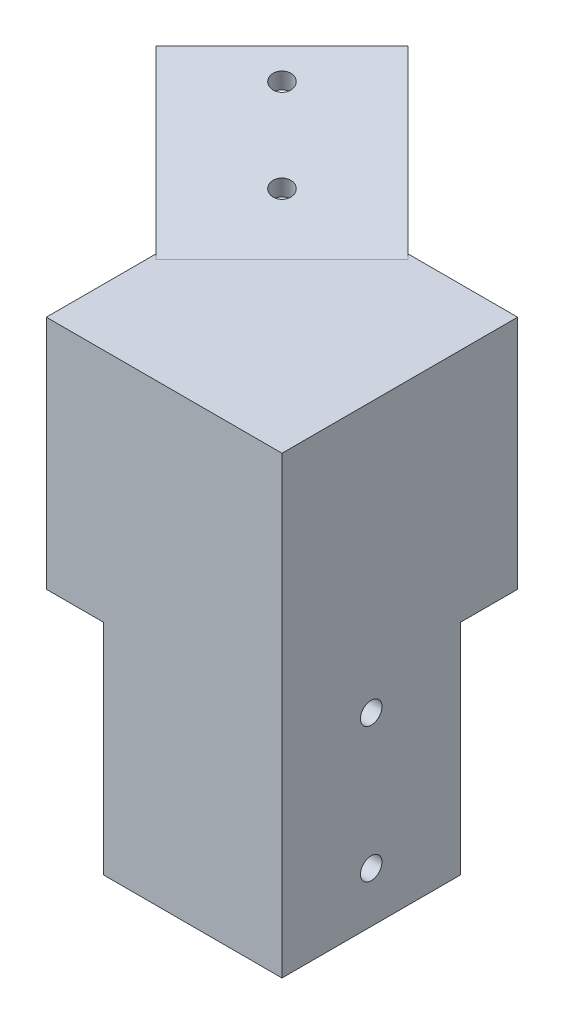
ISO-10303-21;
HEADER;
FILE_DESCRIPTION(('STEP AP214'),'2;1');
FILE_NAME('part.step','',(''),(''),'','','');
FILE_SCHEMA(('AUTOMOTIVE_DESIGN { 1 0 10303 214 1 1 1 1 }'));
ENDSEC;
DATA;
#1=APPLICATION_CONTEXT('core data for automotive mechanical design processes');
#2=APPLICATION_PROTOCOL_DEFINITION('international standard','automotive_design',2000,#1);
#3=PRODUCT_CONTEXT('',#1,'mechanical');
#4=PRODUCT('Part','Part','',(#3));
#5=PRODUCT_RELATED_PRODUCT_CATEGORY('part','',(#4));
#6=PRODUCT_DEFINITION_FORMATION('','',#4);
#7=PRODUCT_DEFINITION_CONTEXT('part definition',#1,'design');
#8=PRODUCT_DEFINITION('design','',#6,#7);
#9=PRODUCT_DEFINITION_SHAPE('','',#8);
#10=(LENGTH_UNIT() NAMED_UNIT(*) SI_UNIT(.MILLI.,.METRE.));
#11=(NAMED_UNIT(*) PLANE_ANGLE_UNIT() SI_UNIT($,.RADIAN.));
#12=(NAMED_UNIT(*) SI_UNIT($,.STERADIAN.) SOLID_ANGLE_UNIT());
#13=UNCERTAINTY_MEASURE_WITH_UNIT(LENGTH_MEASURE(1.E-05),#10,'distance_accuracy_value','');
#14=(GEOMETRIC_REPRESENTATION_CONTEXT(3) GLOBAL_UNCERTAINTY_ASSIGNED_CONTEXT((#13)) GLOBAL_UNIT_ASSIGNED_CONTEXT((#10,
#11,#12)) REPRESENTATION_CONTEXT('',''));
#15=CARTESIAN_POINT('',(0.,0.,0.));
#16=DIRECTION('',(0.,0.,1.));
#17=DIRECTION('',(1.,0.,0.));
#18=AXIS2_PLACEMENT_3D('',#15,#16,#17);
#19=CARTESIAN_POINT('',(-10.25,-50.,-10.25));
#20=DIRECTION('',(0.,0.,-1.));
#21=DIRECTION('',(-1.,0.,0.));
#22=AXIS2_PLACEMENT_3D('',#19,#20,#21);
#23=PLANE('',#22);
#24=DIRECTION('',(0.,1.,0.));
#25=VECTOR('',#24,1.);
#26=CARTESIAN_POINT('',(4.24568901432425,-50.,-10.25));
#27=LINE('',#26,#25);
#28=CARTESIAN_POINT('',(4.24568901432421,-9.53015542412603,-10.25));
#29=VERTEX_POINT('',#28);
#30=CARTESIAN_POINT('',(4.24568901432424,0.,-10.25));
#31=VERTEX_POINT('',#30);
#32=EDGE_CURVE('E241',#29,#31,#27,.T.);
#33=ORIENTED_EDGE('',*,*,#32,.F.);
#34=DIRECTION('',(-0.986393923832144,0.164398987305357,0.));
#35=VECTOR('',#34,1.);
#36=CARTESIAN_POINT('',(-3.2955471224441,-8.27328273466465,-10.25));
#37=LINE('',#36,#35);
#38=CARTESIAN_POINT('',(-10.25,-7.11420725507199,-10.25));
#39=VERTEX_POINT('',#38);
#40=EDGE_CURVE('E246',#29,#39,#37,.T.);
#41=ORIENTED_EDGE('',*,*,#40,.T.);
#42=DIRECTION('',(0.,1.,0.));
#43=VECTOR('',#42,1.);
#44=CARTESIAN_POINT('',(-10.25,-50.,-10.25));
#45=LINE('',#44,#43);
#46=CARTESIAN_POINT('',(-10.25,-50.,-10.25));
#47=VERTEX_POINT('',#46);
#48=EDGE_CURVE('E371',#47,#39,#45,.T.);
#49=ORIENTED_EDGE('',*,*,#48,.F.);
#50=DIRECTION('',(-1.,0.,0.));
#51=VECTOR('',#50,1.);
#52=CARTESIAN_POINT('',(-10.25,-50.,-10.25));
#53=LINE('',#52,#51);
#54=CARTESIAN_POINT('',(10.25,-50.,-10.25));
#55=VERTEX_POINT('',#54);
#56=EDGE_CURVE('E355',#55,#47,#53,.T.);
#57=ORIENTED_EDGE('',*,*,#56,.F.);
#58=DIRECTION('',(0.,1.,0.));
#59=VECTOR('',#58,1.);
#60=CARTESIAN_POINT('',(10.25,-50.,-10.25));
#61=LINE('',#60,#59);
#62=CARTESIAN_POINT('',(10.25,0.,-10.25));
#63=VERTEX_POINT('',#62);
#64=EDGE_CURVE('E364',#55,#63,#61,.T.);
#65=ORIENTED_EDGE('',*,*,#64,.T.);
#66=DIRECTION('',(1.,0.,0.));
#67=VECTOR('',#66,1.);
#68=CARTESIAN_POINT('',(0.,0.,-10.25));
#69=LINE('',#68,#67);
#70=EDGE_CURVE('E252',#31,#63,#69,.T.);
#71=ORIENTED_EDGE('',*,*,#70,.F.);
#72=EDGE_LOOP('',(#33,#41,#49,#57,#65,#71));
#73=FACE_BOUND('',#72,.T.);
#74=ADVANCED_FACE('F47',(#73),#23,.F.);
#75=CARTESIAN_POINT('',(0.,0.,0.));
#76=DIRECTION('',(0.,1.,0.));
#77=DIRECTION('',(0.,0.,1.));
#78=AXIS2_PLACEMENT_3D('',#75,#76,#77);
#79=PLANE('',#78);
#80=DIRECTION('',(0.707106781186547,0.,0.707106781186548));
#81=VECTOR('',#80,1.);
#82=CARTESIAN_POINT('',(7.24784450716212,0.,-7.24784450716212));
#83=LINE('',#82,#81);
#84=CARTESIAN_POINT('',(7.24784450716211,0.,-7.24784450716212));
#85=VERTEX_POINT('',#84);
#86=EDGE_CURVE('E11',#31,#85,#83,.T.);
#87=ORIENTED_EDGE('',*,*,#86,.F.);
#88=ORIENTED_EDGE('',*,*,#70,.T.);
#89=DIRECTION('',(0.,0.,1.));
#90=VECTOR('',#89,1.);
#91=CARTESIAN_POINT('',(10.25,0.,0.));
#92=LINE('',#91,#90);
#93=CARTESIAN_POINT('',(10.25,0.,10.25));
#94=VERTEX_POINT('',#93);
#95=EDGE_CURVE('E249',#63,#94,#92,.T.);
#96=ORIENTED_EDGE('',*,*,#95,.T.);
#97=DIRECTION('',(1.,0.,0.));
#98=VECTOR('',#97,1.);
#99=CARTESIAN_POINT('',(0.,0.,10.25));
#100=LINE('',#99,#98);
#101=CARTESIAN_POINT('',(-10.25,0.,10.25));
#102=VERTEX_POINT('',#101);
#103=EDGE_CURVE('E256',#102,#94,#100,.T.);
#104=ORIENTED_EDGE('',*,*,#103,.F.);
#105=DIRECTION('',(0.,0.,1.));
#106=VECTOR('',#105,1.);
#107=CARTESIAN_POINT('',(-10.25,0.,0.));
#108=LINE('',#107,#106);
#109=CARTESIAN_POINT('',(-10.25,0.,4.24568901432423));
#110=VERTEX_POINT('',#109);
#111=EDGE_CURVE('E254',#110,#102,#108,.T.);
#112=ORIENTED_EDGE('',*,*,#111,.F.);
#113=DIRECTION('',(0.707106781186547,0.,0.707106781186548));
#114=VECTOR('',#113,1.);
#115=CARTESIAN_POINT('',(-7.24784450716211,0.,7.24784450716211));
#116=LINE('',#115,#114);
#117=CARTESIAN_POINT('',(-7.24784450716212,0.,7.24784450716211));
#118=VERTEX_POINT('',#117);
#119=EDGE_CURVE('E56',#110,#118,#116,.T.);
#120=ORIENTED_EDGE('',*,*,#119,.T.);
#121=DIRECTION('',(0.707106781186548,0.,-0.707106781186547));
#122=VECTOR('',#121,1.);
#123=CARTESIAN_POINT('',(0.,0.,0.));
#124=LINE('',#123,#122);
#125=EDGE_CURVE('E400',#118,#85,#124,.T.);
#126=ORIENTED_EDGE('',*,*,#125,.T.);
#127=EDGE_LOOP('',(#87,#88,#96,#104,#112,#120,#126));
#128=FACE_BOUND('',#127,.T.);
#129=ADVANCED_FACE('F473',(#128),#79,.F.);
#130=CARTESIAN_POINT('',(-13.25,-50.,-13.25));
#131=DIRECTION('',(0.,0.,-1.));
#132=DIRECTION('',(-1.,0.,0.));
#133=AXIS2_PLACEMENT_3D('',#130,#131,#132);
#134=PLANE('',#133);
#135=DIRECTION('',(-0.986393923832144,0.164398987305357,0.));
#136=VECTOR('',#135,1.);
#137=CARTESIAN_POINT('',(-6.63320231187402,-10.2992138712442,-13.25));
#138=LINE('',#137,#136);
#139=CARTESIAN_POINT('',(-11.5116702985565,-9.48613587346375,-13.25));
#140=VERTEX_POINT('',#139);
#141=CARTESIAN_POINT('',(-13.25,-9.1964142565565,-13.25));
#142=VERTEX_POINT('',#141);
#143=EDGE_CURVE('E335',#140,#142,#138,.T.);
#144=ORIENTED_EDGE('',*,*,#143,.F.);
#145=DIRECTION('',(0.,-1.,0.));
#146=VECTOR('',#145,1.);
#147=CARTESIAN_POINT('',(-11.5116702985565,-50.,-13.25));
#148=LINE('',#147,#146);
#149=CARTESIAN_POINT('',(-11.5116702985565,-17.5,-13.25));
#150=VERTEX_POINT('',#149);
#151=EDGE_CURVE('E71',#140,#150,#148,.T.);
#152=ORIENTED_EDGE('',*,*,#151,.T.);
#153=DIRECTION('',(-1.,0.,0.));
#154=VECTOR('',#153,1.);
#155=CARTESIAN_POINT('',(-13.25,-17.5,-13.25));
#156=LINE('',#155,#154);
#157=CARTESIAN_POINT('',(13.25,-17.5,-13.25));
#158=VERTEX_POINT('',#157);
#159=EDGE_CURVE('E312',#158,#150,#156,.T.);
#160=ORIENTED_EDGE('',*,*,#159,.F.);
#161=DIRECTION('',(0.,1.,0.));
#162=VECTOR('',#161,1.);
#163=CARTESIAN_POINT('',(13.25,-50.,-13.25));
#164=LINE('',#163,#162);
#165=CARTESIAN_POINT('',(13.25,-50.,-13.25));
#166=VERTEX_POINT('',#165);
#167=EDGE_CURVE('E387',#166,#158,#164,.T.);
#168=ORIENTED_EDGE('',*,*,#167,.F.);
#169=DIRECTION('',(-1.,0.,0.));
#170=VECTOR('',#169,1.);
#171=CARTESIAN_POINT('',(-13.25,-50.,-13.25));
#172=LINE('',#171,#170);
#173=CARTESIAN_POINT('',(-13.25,-50.,-13.25));
#174=VERTEX_POINT('',#173);
#175=EDGE_CURVE('E378',#166,#174,#172,.T.);
#176=ORIENTED_EDGE('',*,*,#175,.T.);
#177=DIRECTION('',(0.,1.,0.));
#178=VECTOR('',#177,1.);
#179=CARTESIAN_POINT('',(-13.25,-50.,-13.25));
#180=LINE('',#179,#178);
#181=EDGE_CURVE('E393',#174,#142,#180,.T.);
#182=ORIENTED_EDGE('',*,*,#181,.T.);
#183=EDGE_LOOP('',(#144,#152,#160,#168,#176,#182));
#184=FACE_BOUND('',#183,.T.);
#185=ADVANCED_FACE('F480',(#184),#134,.T.);
#186=CARTESIAN_POINT('',(-13.25,-50.,-13.25));
#187=DIRECTION('',(-1.,0.,0.));
#188=DIRECTION('',(0.,0.,1.));
#189=AXIS2_PLACEMENT_3D('',#186,#187,#188);
#190=PLANE('',#189);
#191=CARTESIAN_POINT('',(-13.25,-22.5,0.));
#192=DIRECTION('',(-1.,0.,0.));
#193=DIRECTION('',(0.,0.,1.));
#194=AXIS2_PLACEMENT_3D('',#191,#192,#193);
#195=CIRCLE('',#194,1.6);
#196=CARTESIAN_POINT('',(-13.25,-22.5,1.6));
#197=VERTEX_POINT('',#196);
#198=EDGE_CURVE('E412',#197,#197,#195,.T.);
#199=ORIENTED_EDGE('',*,*,#198,.F.);
#200=EDGE_LOOP('',(#199));
#201=FACE_BOUND('',#200,.T.);
#202=CARTESIAN_POINT('',(-13.25,-42.5,0.));
#203=DIRECTION('',(-1.,0.,0.));
#204=DIRECTION('',(0.,0.,1.));
#205=AXIS2_PLACEMENT_3D('',#202,#203,#204);
#206=CIRCLE('',#205,1.6);
#207=CARTESIAN_POINT('',(-13.25,-42.5,1.6));
#208=VERTEX_POINT('',#207);
#209=EDGE_CURVE('E417',#208,#208,#206,.T.);
#210=ORIENTED_EDGE('',*,*,#209,.F.);
#211=EDGE_LOOP('',(#210));
#212=FACE_BOUND('',#211,.T.);
#213=DIRECTION('',(0.,0.,1.));
#214=VECTOR('',#213,1.);
#215=CARTESIAN_POINT('',(-13.25,-17.5,-13.25));
#216=LINE('',#215,#214);
#217=CARTESIAN_POINT('',(-13.25,-17.5,-11.5116702985565));
#218=VERTEX_POINT('',#217);
#219=CARTESIAN_POINT('',(-13.25,-17.5,13.25));
#220=VERTEX_POINT('',#219);
#221=EDGE_CURVE('E309',#218,#220,#216,.T.);
#222=ORIENTED_EDGE('',*,*,#221,.F.);
#223=DIRECTION('',(0.,1.,0.));
#224=VECTOR('',#223,1.);
#225=CARTESIAN_POINT('',(-13.25,-50.,-11.5116702985565));
#226=LINE('',#225,#224);
#227=CARTESIAN_POINT('',(-13.25,-9.48613587346375,-11.5116702985565));
#228=VERTEX_POINT('',#227);
#229=EDGE_CURVE('E299',#218,#228,#226,.T.);
#230=ORIENTED_EDGE('',*,*,#229,.T.);
#231=DIRECTION('',(0.,-0.164398987305357,0.986393923832144));
#232=VECTOR('',#231,1.);
#233=CARTESIAN_POINT('',(-13.25,-10.2992138712442,-6.63320231187402));
#234=LINE('',#233,#232);
#235=EDGE_CURVE('E349',#142,#228,#234,.T.);
#236=ORIENTED_EDGE('',*,*,#235,.F.);
#237=ORIENTED_EDGE('',*,*,#181,.F.);
#238=DIRECTION('',(0.,0.,1.));
#239=VECTOR('',#238,1.);
#240=CARTESIAN_POINT('',(-13.25,-50.,-13.25));
#241=LINE('',#240,#239);
#242=CARTESIAN_POINT('',(-13.25,-50.,13.25));
#243=VERTEX_POINT('',#242);
#244=EDGE_CURVE('E381',#174,#243,#241,.T.);
#245=ORIENTED_EDGE('',*,*,#244,.T.);
#246=DIRECTION('',(0.,1.,0.));
#247=VECTOR('',#246,1.);
#248=CARTESIAN_POINT('',(-13.25,-50.,13.25));
#249=LINE('',#248,#247);
#250=EDGE_CURVE('E391',#243,#220,#249,.T.);
#251=ORIENTED_EDGE('',*,*,#250,.T.);
#252=EDGE_LOOP('',(#222,#230,#236,#237,#245,#251));
#253=FACE_BOUND('',#252,.T.);
#254=ADVANCED_FACE('F501',(#201,#212,#253),#190,.T.);
#255=CARTESIAN_POINT('',(-32.749590513994,21.44740409307,-32.749590513994));
#256=DIRECTION('',(-0.162221421130763,-0.973328526784575,-0.162221421130763));
#257=DIRECTION('',(0.,0.164398987305357,-0.986393923832144));
#258=AXIS2_PLACEMENT_3D('',#255,#256,#257);
#259=PLANE('',#258);
#260=CARTESIAN_POINT('',(-18.9846464817602,16.8590894156588,-18.9846464817603));
#261=DIRECTION('',(-0.162221421130763,-0.973328526784575,-0.162221421130763));
#262=DIRECTION('',(0.,0.164398987305357,-0.986393923832144));
#263=AXIS2_PLACEMENT_3D('',#260,#261,#262);
#264=CIRCLE('',#263,1.5);
#265=CARTESIAN_POINT('',(-18.9846464817602,17.1056878966168,-20.4642373675085));
#266=VERTEX_POINT('',#265);
#267=EDGE_CURVE('E230',#266,#266,#264,.T.);
#268=ORIENTED_EDGE('',*,*,#267,.F.);
#269=EDGE_LOOP('',(#268));
#270=FACE_BOUND('',#269,.T.);
#271=CARTESIAN_POINT('',(-29.3083545059355,20.3003254237172,-29.3083545059355));
#272=DIRECTION('',(-0.162221421130763,-0.973328526784575,-0.162221421130763));
#273=DIRECTION('',(0.,0.164398987305357,-0.986393923832144));
#274=AXIS2_PLACEMENT_3D('',#271,#272,#273);
#275=CIRCLE('',#274,1.5);
#276=CARTESIAN_POINT('',(-29.3083545059355,20.5469239046752,-30.7879453916838));
#277=VERTEX_POINT('',#276);
#278=EDGE_CURVE('E440',#277,#277,#275,.T.);
#279=ORIENTED_EDGE('',*,*,#278,.F.);
#280=EDGE_LOOP('',(#279));
#281=FACE_BOUND('',#280,.T.);
#282=DIRECTION('',(0.688247201611685,-0.229415733870562,0.688247201611685));
#283=VECTOR('',#282,1.);
#284=CARTESIAN_POINT('',(-25.5017460068318,21.44740409307,-39.9974350211561));
#285=LINE('',#284,#283);
#286=CARTESIAN_POINT('',(-25.5017460068318,21.44740409307,-39.9974350211561));
#287=VERTEX_POINT('',#286);
#288=CARTESIAN_POINT('',(8.91061407375243,9.9766173995419,-5.5850749405718));
#289=VERTEX_POINT('',#288);
#290=EDGE_CURVE('E211',#287,#289,#285,.T.);
#291=ORIENTED_EDGE('',*,*,#290,.T.);
#292=DIRECTION('',(0.707106781186548,0.,-0.707106781186547));
#293=VECTOR('',#292,1.);
#294=CARTESIAN_POINT('',(1.66276956659031,9.9766173995419,1.66276956659031));
#295=LINE('',#294,#293);
#296=CARTESIAN_POINT('',(-5.5850749405718,9.9766173995419,8.91061407375243));
#297=VERTEX_POINT('',#296);
#298=EDGE_CURVE('E213',#297,#289,#295,.T.);
#299=ORIENTED_EDGE('',*,*,#298,.F.);
#300=DIRECTION('',(0.688247201611685,-0.229415733870562,0.688247201611685));
#301=VECTOR('',#300,1.);
#302=CARTESIAN_POINT('',(-39.9974350211561,21.44740409307,-25.5017460068318));
#303=LINE('',#302,#301);
#304=CARTESIAN_POINT('',(-39.9974350211561,21.44740409307,-25.5017460068318));
#305=VERTEX_POINT('',#304);
#306=EDGE_CURVE('E333',#305,#297,#303,.T.);
#307=ORIENTED_EDGE('',*,*,#306,.F.);
#308=DIRECTION('',(0.707106781186548,0.,-0.707106781186547));
#309=VECTOR('',#308,1.);
#310=CARTESIAN_POINT('',(-32.749590513994,21.44740409307,-32.749590513994));
#311=LINE('',#310,#309);
#312=EDGE_CURVE('E216',#305,#287,#311,.T.);
#313=ORIENTED_EDGE('',*,*,#312,.T.);
#314=EDGE_LOOP('',(#291,#299,#307,#313));
#315=FACE_BOUND('',#314,.T.);
#316=ADVANCED_FACE('F212',(#270,#281,#315),#259,.T.);
#317=CARTESIAN_POINT('',(-41.6602045877464,11.4707866935281,-27.1645155734222));
#318=DIRECTION('',(-0.707106781186548,0.,0.707106781186547));
#319=DIRECTION('',(0.707106781186547,0.,0.707106781186548));
#320=AXIS2_PLACEMENT_3D('',#317,#318,#319);
#321=PLANE('',#320);
#322=ORIENTED_EDGE('',*,*,#306,.T.);
#323=DIRECTION('',(-0.162221421130762,-0.973328526784575,-0.162221421130763));
#324=VECTOR('',#323,1.);
#325=CARTESIAN_POINT('',(-7.24784450716212,0.,7.24784450716211));
#326=LINE('',#325,#324);
#327=EDGE_CURVE('E225',#297,#118,#326,.T.);
#328=ORIENTED_EDGE('',*,*,#327,.T.);
#329=ORIENTED_EDGE('',*,*,#119,.F.);
#330=DIRECTION('',(0.,1.,0.));
#331=VECTOR('',#330,1.);
#332=CARTESIAN_POINT('',(-10.25,-50.,4.24568901432421));
#333=LINE('',#332,#331);
#334=CARTESIAN_POINT('',(-10.25,-9.53015542412604,4.24568901432422));
#335=VERTEX_POINT('',#334);
#336=EDGE_CURVE('E238',#335,#110,#333,.T.);
#337=ORIENTED_EDGE('',*,*,#336,.F.);
#338=DIRECTION('',(0.688247201611685,-0.229415733870562,0.688247201611685));
#339=VECTOR('',#338,1.);
#340=CARTESIAN_POINT('',(-43.3229741543367,1.4941692939862,-28.8272851400125));
#341=LINE('',#340,#339);
#342=CARTESIAN_POINT('',(-43.3229741543367,1.4941692939862,-28.8272851400125));
#343=VERTEX_POINT('',#342);
#344=EDGE_CURVE('E336',#343,#335,#341,.T.);
#345=ORIENTED_EDGE('',*,*,#344,.F.);
#346=DIRECTION('',(-0.162221421130762,-0.973328526784575,-0.162221421130763));
#347=VECTOR('',#346,1.);
#348=CARTESIAN_POINT('',(-41.6602045877464,11.4707866935281,-27.1645155734222));
#349=LINE('',#348,#347);
#350=EDGE_CURVE('E329',#305,#343,#349,.T.);
#351=ORIENTED_EDGE('',*,*,#350,.F.);
#352=EDGE_LOOP('',(#322,#328,#329,#337,#345,#351));
#353=FACE_BOUND('',#352,.T.);
#354=ADVANCED_FACE('F575',(#353),#321,.F.);
#355=CARTESIAN_POINT('',(-36.0751296471746,1.4941692939862,-36.0751296471746));
#356=DIRECTION('',(-0.162221421130763,-0.973328526784575,-0.162221421130763));
#357=DIRECTION('',(0.986393923832144,-0.164398987305357,0.));
#358=AXIS2_PLACEMENT_3D('',#355,#356,#357);
#359=PLANE('',#358);
#360=CARTESIAN_POINT('',(-22.3101856149409,-3.09414538342504,-22.3101856149409));
#361=DIRECTION('',(-0.162221421130763,-0.973328526784575,-0.162221421130763));
#362=DIRECTION('',(0.986393923832144,-0.164398987305357,0.));
#363=AXIS2_PLACEMENT_3D('',#360,#361,#362);
#364=CIRCLE('',#363,1.5);
#365=CARTESIAN_POINT('',(-20.8305947291927,-3.34074386438308,-22.3101856149409));
#366=VERTEX_POINT('',#365);
#367=EDGE_CURVE('E233',#366,#366,#364,.T.);
#368=ORIENTED_EDGE('',*,*,#367,.T.);
#369=EDGE_LOOP('',(#368));
#370=FACE_BOUND('',#369,.T.);
#371=CARTESIAN_POINT('',(-32.6338936391162,0.347090624633381,-32.6338936391162));
#372=DIRECTION('',(-0.162221421130763,-0.973328526784575,-0.162221421130763));
#373=DIRECTION('',(0.986393923832144,-0.164398987305357,0.));
#374=AXIS2_PLACEMENT_3D('',#371,#372,#373);
#375=CIRCLE('',#374,1.5);
#376=CARTESIAN_POINT('',(-31.1543027533679,0.100492143675345,-32.6338936391162));
#377=VERTEX_POINT('',#376);
#378=EDGE_CURVE('E437',#377,#377,#375,.T.);
#379=ORIENTED_EDGE('',*,*,#378,.T.);
#380=EDGE_LOOP('',(#379));
#381=FACE_BOUND('',#380,.T.);
#382=ORIENTED_EDGE('',*,*,#344,.T.);
#383=DIRECTION('',(0.,-0.164398987305357,0.986393923832144));
#384=VECTOR('',#383,1.);
#385=CARTESIAN_POINT('',(-10.25,-8.27328273466464,-3.29554712244411));
#386=LINE('',#385,#384);
#387=EDGE_CURVE('E243',#39,#335,#386,.T.);
#388=ORIENTED_EDGE('',*,*,#387,.F.);
#389=ORIENTED_EDGE('',*,*,#40,.F.);
#390=DIRECTION('',(0.688247201611685,-0.229415733870562,0.688247201611685));
#391=VECTOR('',#390,1.);
#392=CARTESIAN_POINT('',(-28.8272851400125,1.4941692939862,-43.3229741543367));
#393=LINE('',#392,#391);
#394=CARTESIAN_POINT('',(-28.8272851400125,1.4941692939862,-43.3229741543367));
#395=VERTEX_POINT('',#394);
#396=EDGE_CURVE('E220',#395,#29,#393,.T.);
#397=ORIENTED_EDGE('',*,*,#396,.F.);
#398=DIRECTION('',(0.707106781186548,0.,-0.707106781186547));
#399=VECTOR('',#398,1.);
#400=CARTESIAN_POINT('',(-36.0751296471746,1.4941692939862,-36.0751296471746));
#401=LINE('',#400,#399);
#402=EDGE_CURVE('E327',#343,#395,#401,.T.);
#403=ORIENTED_EDGE('',*,*,#402,.F.);
#404=EDGE_LOOP('',(#382,#388,#389,#397,#403));
#405=FACE_BOUND('',#404,.T.);
#406=ADVANCED_FACE('F448',(#370,#381,#405),#359,.F.);
#407=CARTESIAN_POINT('',(-25.0431952298625,11.4707866935281,-43.781524931306));
#408=DIRECTION('',(-0.707106781186548,0.,0.707106781186547));
#409=DIRECTION('',(0.707106781186547,0.,0.707106781186548));
#410=AXIS2_PLACEMENT_3D('',#407,#408,#409);
#411=PLANE('',#410);
#412=DIRECTION('',(0.,-1.,0.));
#413=VECTOR('',#412,1.);
#414=CARTESIAN_POINT('',(-3.01167029855649,17.5,-21.75));
#415=LINE('',#414,#413);
#416=CARTESIAN_POINT('',(-3.0116702985565,17.5,-21.75));
#417=VERTEX_POINT('',#416);
#418=CARTESIAN_POINT('',(-3.01167029855649,-9.48613587346374,-21.75));
#419=VERTEX_POINT('',#418);
#420=EDGE_CURVE('E292',#417,#419,#415,.T.);
#421=ORIENTED_EDGE('',*,*,#420,.T.);
#422=DIRECTION('',(0.688247201611685,-0.229415733870562,0.688247201611685));
#423=VECTOR('',#422,1.);
#424=CARTESIAN_POINT('',(-27.1926290598451,-1.42581628636753,-45.9309587612886));
#425=LINE('',#424,#423);
#426=CARTESIAN_POINT('',(-27.1926290598451,-1.42581628636753,-45.9309587612886));
#427=VERTEX_POINT('',#426);
#428=EDGE_CURVE('E221',#427,#419,#425,.T.);
#429=ORIENTED_EDGE('',*,*,#428,.F.);
#430=DIRECTION('',(-0.162221421130763,-0.973328526784575,-0.162221421130762));
#431=VECTOR('',#430,1.);
#432=CARTESIAN_POINT('',(-25.0431952298625,11.4707866935281,-43.781524931306));
#433=LINE('',#432,#431);
#434=CARTESIAN_POINT('',(-22.8937613998799,24.3673896734237,-41.6320911013234));
#435=VERTEX_POINT('',#434);
#436=EDGE_CURVE('E314',#435,#427,#433,.T.);
#437=ORIENTED_EDGE('',*,*,#436,.F.);
#438=DIRECTION('',(0.688247201611685,-0.229415733870562,0.688247201611685));
#439=VECTOR('',#438,1.);
#440=CARTESIAN_POINT('',(-22.8937613998799,24.3673896734237,-41.6320911013234));
#441=LINE('',#440,#439);
#442=CARTESIAN_POINT('',(-2.29159237960877,17.5,-21.0299220810523));
#443=VERTEX_POINT('',#442);
#444=EDGE_CURVE('E332',#435,#443,#441,.T.);
#445=ORIENTED_EDGE('',*,*,#444,.T.);
#446=DIRECTION('',(0.707106781186547,0.,0.707106781186548));
#447=VECTOR('',#446,1.);
#448=CARTESIAN_POINT('',(-25.0431952298625,17.5,-43.781524931306));
#449=LINE('',#448,#447);
#450=EDGE_CURVE('E306',#417,#443,#449,.T.);
#451=ORIENTED_EDGE('',*,*,#450,.F.);
#452=EDGE_LOOP('',(#421,#429,#437,#445,#451));
#453=FACE_BOUND('',#452,.T.);
#454=ADVANCED_FACE('F554',(#453),#411,.F.);
#455=CARTESIAN_POINT('',(-36.5617939105669,-1.42581628636753,-36.5617939105669));
#456=DIRECTION('',(-0.162221421130763,-0.973328526784575,-0.162221421130763));
#457=DIRECTION('',(0.986393923832144,-0.164398987305357,0.));
#458=AXIS2_PLACEMENT_3D('',#455,#456,#457);
#459=PLANE('',#458);
#460=CARTESIAN_POINT('',(-22.7968498783332,-6.01413096377877,-22.7968498783332));
#461=DIRECTION('',(-0.162221421130763,-0.973328526784575,-0.162221421130763));
#462=DIRECTION('',(0.986393923832144,-0.164398987305357,0.));
#463=AXIS2_PLACEMENT_3D('',#460,#461,#462);
#464=CIRCLE('',#463,1.5);
#465=CARTESIAN_POINT('',(-21.3172589925849,-6.26072944473681,-22.7968498783332));
#466=VERTEX_POINT('',#465);
#467=EDGE_CURVE('E443',#466,#466,#464,.T.);
#468=ORIENTED_EDGE('',*,*,#467,.F.);
#469=EDGE_LOOP('',(#468));
#470=FACE_BOUND('',#469,.T.);
#471=CARTESIAN_POINT('',(-33.1205579025084,-2.57289495572034,-33.1205579025085));
#472=DIRECTION('',(-0.162221421130763,-0.973328526784575,-0.162221421130763));
#473=DIRECTION('',(0.986393923832144,-0.164398987305357,0.));
#474=AXIS2_PLACEMENT_3D('',#471,#472,#473);
#475=CIRCLE('',#474,1.5);
#476=CARTESIAN_POINT('',(-31.6409670167602,-2.81949343667838,-33.1205579025085));
#477=VERTEX_POINT('',#476);
#478=EDGE_CURVE('E434',#477,#477,#475,.T.);
#479=ORIENTED_EDGE('',*,*,#478,.F.);
#480=EDGE_LOOP('',(#479));
#481=FACE_BOUND('',#480,.T.);
#482=ORIENTED_EDGE('',*,*,#428,.T.);
#483=DIRECTION('',(-0.707106781186548,0.,0.707106781186547));
#484=VECTOR('',#483,1.);
#485=CARTESIAN_POINT('',(-12.3808351492782,-9.48613587346375,-12.3808351492782));
#486=LINE('',#485,#484);
#487=EDGE_CURVE('E300',#419,#140,#486,.T.);
#488=ORIENTED_EDGE('',*,*,#487,.T.);
#489=ORIENTED_EDGE('',*,*,#143,.T.);
#490=ORIENTED_EDGE('',*,*,#235,.T.);
#491=CARTESIAN_POINT('',(-21.75,-9.48613587346374,-3.0116702985565));
#492=VERTEX_POINT('',#491);
#493=EDGE_CURVE('E297',#228,#492,#486,.T.);
#494=ORIENTED_EDGE('',*,*,#493,.T.);
#495=DIRECTION('',(0.688247201611685,-0.229415733870562,0.688247201611685));
#496=VECTOR('',#495,1.);
#497=CARTESIAN_POINT('',(-45.9309587612886,-1.42581628636753,-27.1926290598451));
#498=LINE('',#497,#496);
#499=CARTESIAN_POINT('',(-45.9309587612886,-1.42581628636753,-27.1926290598451));
#500=VERTEX_POINT('',#499);
#501=EDGE_CURVE('E341',#500,#492,#498,.T.);
#502=ORIENTED_EDGE('',*,*,#501,.F.);
#503=DIRECTION('',(0.707106781186548,0.,-0.707106781186547));
#504=VECTOR('',#503,1.);
#505=CARTESIAN_POINT('',(-36.5617939105669,-1.42581628636753,-36.5617939105669));
#506=LINE('',#505,#504);
#507=EDGE_CURVE('E321',#500,#427,#506,.T.);
#508=ORIENTED_EDGE('',*,*,#507,.T.);
#509=EDGE_LOOP('',(#482,#488,#489,#490,#494,#502,#508));
#510=FACE_BOUND('',#509,.T.);
#511=ADVANCED_FACE('F532',(#470,#481,#510),#459,.T.);
#512=CARTESIAN_POINT('',(-43.781524931306,11.4707866935281,-25.0431952298625));
#513=DIRECTION('',(-0.707106781186548,0.,0.707106781186547));
#514=DIRECTION('',(0.707106781186547,0.,0.707106781186548));
#515=AXIS2_PLACEMENT_3D('',#512,#513,#514);
#516=PLANE('',#515);
#517=ORIENTED_EDGE('',*,*,#501,.T.);
#518=DIRECTION('',(0.,-1.,0.));
#519=VECTOR('',#518,1.);
#520=CARTESIAN_POINT('',(-21.75,17.5,-3.0116702985565));
#521=LINE('',#520,#519);
#522=CARTESIAN_POINT('',(-21.75,17.5,-3.0116702985565));
#523=VERTEX_POINT('',#522);
#524=EDGE_CURVE('E288',#523,#492,#521,.T.);
#525=ORIENTED_EDGE('',*,*,#524,.F.);
#526=DIRECTION('',(0.707106781186547,0.,0.707106781186548));
#527=VECTOR('',#526,1.);
#528=CARTESIAN_POINT('',(-43.781524931306,17.5,-25.0431952298625));
#529=LINE('',#528,#527);
#530=CARTESIAN_POINT('',(-21.0299220810523,17.5,-2.29159237960877));
#531=VERTEX_POINT('',#530);
#532=EDGE_CURVE('E303',#523,#531,#529,.T.);
#533=ORIENTED_EDGE('',*,*,#532,.T.);
#534=DIRECTION('',(0.688247201611685,-0.229415733870562,0.688247201611685));
#535=VECTOR('',#534,1.);
#536=CARTESIAN_POINT('',(-41.6320911013234,24.3673896734237,-22.8937613998799));
#537=LINE('',#536,#535);
#538=CARTESIAN_POINT('',(-41.6320911013234,24.3673896734237,-22.8937613998799));
#539=VERTEX_POINT('',#538);
#540=EDGE_CURVE('E344',#539,#531,#537,.T.);
#541=ORIENTED_EDGE('',*,*,#540,.F.);
#542=DIRECTION('',(-0.162221421130763,-0.973328526784575,-0.162221421130762));
#543=VECTOR('',#542,1.);
#544=CARTESIAN_POINT('',(-43.781524931306,11.4707866935281,-25.0431952298625));
#545=LINE('',#544,#543);
#546=EDGE_CURVE('E318',#539,#500,#545,.T.);
#547=ORIENTED_EDGE('',*,*,#546,.T.);
#548=EDGE_LOOP('',(#517,#525,#533,#541,#547));
#549=FACE_BOUND('',#548,.T.);
#550=ADVANCED_FACE('F545',(#549),#516,.T.);
#551=CARTESIAN_POINT('',(-32.2629262506017,24.3673896734237,-32.2629262506017));
#552=DIRECTION('',(-0.162221421130763,-0.973328526784575,-0.162221421130763));
#553=DIRECTION('',(0.986393923832144,-0.164398987305357,0.));
#554=AXIS2_PLACEMENT_3D('',#551,#552,#553);
#555=PLANE('',#554);
#556=CARTESIAN_POINT('',(-18.497982218368,19.7790749960125,-18.497982218368));
#557=DIRECTION('',(0.162221421130763,0.973328526784575,0.162221421130762));
#558=DIRECTION('',(-0.986393923832144,0.164398987305357,0.));
#559=AXIS2_PLACEMENT_3D('',#556,#557,#558);
#560=CIRCLE('',#559,1.5);
#561=CARTESIAN_POINT('',(-19.9775731041162,20.0256734769705,-18.497982218368));
#562=VERTEX_POINT('',#561);
#563=EDGE_CURVE('E428',#562,#562,#560,.T.);
#564=ORIENTED_EDGE('',*,*,#563,.F.);
#565=EDGE_LOOP('',(#564));
#566=FACE_BOUND('',#565,.T.);
#567=CARTESIAN_POINT('',(-28.8216902425432,23.2203110040709,-28.8216902425433));
#568=DIRECTION('',(0.162221421130763,0.973328526784575,0.162221421130762));
#569=DIRECTION('',(-0.986393923832144,0.164398987305357,0.));
#570=AXIS2_PLACEMENT_3D('',#567,#568,#569);
#571=CIRCLE('',#570,1.5);
#572=CARTESIAN_POINT('',(-30.3012811282915,23.4669094850289,-28.8216902425433));
#573=VERTEX_POINT('',#572);
#574=EDGE_CURVE('E431',#573,#573,#571,.T.);
#575=ORIENTED_EDGE('',*,*,#574,.F.);
#576=EDGE_LOOP('',(#575));
#577=FACE_BOUND('',#576,.T.);
#578=DIRECTION('',(-0.707106781186547,0.,0.707106781186548));
#579=VECTOR('',#578,1.);
#580=CARTESIAN_POINT('',(-11.6607572303305,17.5,-11.6607572303305));
#581=LINE('',#580,#579);
#582=EDGE_CURVE('E390',#443,#531,#581,.T.);
#583=ORIENTED_EDGE('',*,*,#582,.F.);
#584=ORIENTED_EDGE('',*,*,#444,.F.);
#585=DIRECTION('',(0.707106781186548,0.,-0.707106781186547));
#586=VECTOR('',#585,1.);
#587=CARTESIAN_POINT('',(-32.2629262506017,24.3673896734237,-32.2629262506017));
#588=LINE('',#587,#586);
#589=EDGE_CURVE('E316',#539,#435,#588,.T.);
#590=ORIENTED_EDGE('',*,*,#589,.F.);
#591=ORIENTED_EDGE('',*,*,#540,.T.);
#592=EDGE_LOOP('',(#583,#584,#590,#591));
#593=FACE_BOUND('',#592,.T.);
#594=ADVANCED_FACE('F550',(#566,#577,#593),#555,.F.);
#595=CARTESIAN_POINT('',(-27.1645155734222,11.4707866935281,-41.6602045877464));
#596=DIRECTION('',(-0.707106781186548,0.,0.707106781186547));
#597=DIRECTION('',(0.707106781186547,0.,0.707106781186548));
#598=AXIS2_PLACEMENT_3D('',#595,#596,#597);
#599=PLANE('',#598);
#600=ORIENTED_EDGE('',*,*,#396,.T.);
#601=ORIENTED_EDGE('',*,*,#32,.T.);
#602=ORIENTED_EDGE('',*,*,#86,.T.);
#603=DIRECTION('',(-0.162221421130762,-0.973328526784575,-0.162221421130763));
#604=VECTOR('',#603,1.);
#605=CARTESIAN_POINT('',(7.24784450716211,0.,-7.24784450716212));
#606=LINE('',#605,#604);
#607=EDGE_CURVE('E64',#289,#85,#606,.T.);
#608=ORIENTED_EDGE('',*,*,#607,.F.);
#609=ORIENTED_EDGE('',*,*,#290,.F.);
#610=DIRECTION('',(-0.162221421130762,-0.973328526784575,-0.162221421130763));
#611=VECTOR('',#610,1.);
#612=CARTESIAN_POINT('',(-27.1645155734222,11.4707866935281,-41.6602045877464));
#613=LINE('',#612,#611);
#614=EDGE_CURVE('E325',#287,#395,#613,.T.);
#615=ORIENTED_EDGE('',*,*,#614,.T.);
#616=EDGE_LOOP('',(#600,#601,#602,#608,#609,#615));
#617=FACE_BOUND('',#616,.T.);
#618=ADVANCED_FACE('F227',(#617),#599,.T.);
#619=CARTESIAN_POINT('',(13.25,-50.,-13.25));
#620=DIRECTION('',(1.,0.,0.));
#621=DIRECTION('',(0.,0.,-1.));
#622=AXIS2_PLACEMENT_3D('',#619,#620,#621);
#623=PLANE('',#622);
#624=CARTESIAN_POINT('',(13.25,-22.5,0.));
#625=DIRECTION('',(-1.,0.,0.));
#626=DIRECTION('',(0.,0.,1.));
#627=AXIS2_PLACEMENT_3D('',#624,#625,#626);
#628=CIRCLE('',#627,1.6);
#629=CARTESIAN_POINT('',(13.25,-22.5,1.6));
#630=VERTEX_POINT('',#629);
#631=EDGE_CURVE('E406',#630,#630,#628,.T.);
#632=ORIENTED_EDGE('',*,*,#631,.T.);
#633=EDGE_LOOP('',(#632));
#634=FACE_BOUND('',#633,.T.);
#635=CARTESIAN_POINT('',(13.25,-42.5,0.));
#636=DIRECTION('',(-1.,0.,0.));
#637=DIRECTION('',(0.,0.,1.));
#638=AXIS2_PLACEMENT_3D('',#635,#636,#637);
#639=CIRCLE('',#638,1.6);
#640=CARTESIAN_POINT('',(13.25,-42.5,1.6));
#641=VERTEX_POINT('',#640);
#642=EDGE_CURVE('E422',#641,#641,#639,.T.);
#643=ORIENTED_EDGE('',*,*,#642,.T.);
#644=EDGE_LOOP('',(#643));
#645=FACE_BOUND('',#644,.T.);
#646=ORIENTED_EDGE('',*,*,#167,.T.);
#647=DIRECTION('',(0.,0.,-1.));
#648=VECTOR('',#647,1.);
#649=CARTESIAN_POINT('',(13.25,-17.5,-21.75));
#650=LINE('',#649,#648);
#651=CARTESIAN_POINT('',(13.25,-17.5,-21.75));
#652=VERTEX_POINT('',#651);
#653=EDGE_CURVE('E259',#158,#652,#650,.T.);
#654=ORIENTED_EDGE('',*,*,#653,.T.);
#655=DIRECTION('',(0.,-1.,0.));
#656=VECTOR('',#655,1.);
#657=CARTESIAN_POINT('',(13.25,17.5,-21.75));
#658=LINE('',#657,#656);
#659=CARTESIAN_POINT('',(13.25,17.5,-21.75));
#660=VERTEX_POINT('',#659);
#661=EDGE_CURVE('E294',#660,#652,#658,.T.);
#662=ORIENTED_EDGE('',*,*,#661,.F.);
#663=DIRECTION('',(0.,0.,-1.));
#664=VECTOR('',#663,1.);
#665=CARTESIAN_POINT('',(13.25,17.5,-21.75));
#666=LINE('',#665,#664);
#667=CARTESIAN_POINT('',(13.25,17.5,13.25));
#668=VERTEX_POINT('',#667);
#669=EDGE_CURVE('E260',#668,#660,#666,.T.);
#670=ORIENTED_EDGE('',*,*,#669,.F.);
#671=DIRECTION('',(0.,1.,0.));
#672=VECTOR('',#671,1.);
#673=CARTESIAN_POINT('',(13.25,-50.,13.25));
#674=LINE('',#673,#672);
#675=CARTESIAN_POINT('',(13.25,-50.,13.25));
#676=VERTEX_POINT('',#675);
#677=EDGE_CURVE('E388',#676,#668,#674,.T.);
#678=ORIENTED_EDGE('',*,*,#677,.F.);
#679=DIRECTION('',(0.,0.,-1.));
#680=VECTOR('',#679,1.);
#681=CARTESIAN_POINT('',(13.25,-50.,-13.25));
#682=LINE('',#681,#680);
#683=EDGE_CURVE('E367',#676,#166,#682,.T.);
#684=ORIENTED_EDGE('',*,*,#683,.T.);
#685=EDGE_LOOP('',(#646,#654,#662,#670,#678,#684));
#686=FACE_BOUND('',#685,.T.);
#687=ADVANCED_FACE('F49',(#634,#645,#686),#623,.T.);
#688=CARTESIAN_POINT('',(-13.25,-50.,13.25));
#689=DIRECTION('',(0.,0.,1.));
#690=DIRECTION('',(1.,0.,0.));
#691=AXIS2_PLACEMENT_3D('',#688,#689,#690);
#692=PLANE('',#691);
#693=ORIENTED_EDGE('',*,*,#677,.T.);
#694=DIRECTION('',(1.,0.,0.));
#695=VECTOR('',#694,1.);
#696=CARTESIAN_POINT('',(13.25,17.5,13.25));
#697=LINE('',#696,#695);
#698=CARTESIAN_POINT('',(-21.75,17.5,13.25));
#699=VERTEX_POINT('',#698);
#700=EDGE_CURVE('E269',#699,#668,#697,.T.);
#701=ORIENTED_EDGE('',*,*,#700,.F.);
#702=DIRECTION('',(0.,-1.,0.));
#703=VECTOR('',#702,1.);
#704=CARTESIAN_POINT('',(-21.75,17.5,13.25));
#705=LINE('',#704,#703);
#706=CARTESIAN_POINT('',(-21.75,-17.5,13.25));
#707=VERTEX_POINT('',#706);
#708=EDGE_CURVE('E272',#699,#707,#705,.T.);
#709=ORIENTED_EDGE('',*,*,#708,.T.);
#710=DIRECTION('',(1.,0.,0.));
#711=VECTOR('',#710,1.);
#712=CARTESIAN_POINT('',(13.25,-17.5,13.25));
#713=LINE('',#712,#711);
#714=EDGE_CURVE('E264',#707,#220,#713,.T.);
#715=ORIENTED_EDGE('',*,*,#714,.T.);
#716=ORIENTED_EDGE('',*,*,#250,.F.);
#717=DIRECTION('',(1.,0.,0.));
#718=VECTOR('',#717,1.);
#719=CARTESIAN_POINT('',(-13.25,-50.,13.25));
#720=LINE('',#719,#718);
#721=EDGE_CURVE('E384',#243,#676,#720,.T.);
#722=ORIENTED_EDGE('',*,*,#721,.T.);
#723=EDGE_LOOP('',(#693,#701,#709,#715,#716,#722));
#724=FACE_BOUND('',#723,.T.);
#725=ADVANCED_FACE('F496',(#724),#692,.T.);
#726=CARTESIAN_POINT('',(0.,-50.,0.));
#727=DIRECTION('',(0.,1.,0.));
#728=DIRECTION('',(0.,0.,1.));
#729=AXIS2_PLACEMENT_3D('',#726,#727,#728);
#730=PLANE('',#729);
#731=DIRECTION('',(1.,0.,0.));
#732=VECTOR('',#731,1.);
#733=CARTESIAN_POINT('',(-10.25,-50.,10.25));
#734=LINE('',#733,#732);
#735=CARTESIAN_POINT('',(-10.25,-50.,10.25));
#736=VERTEX_POINT('',#735);
#737=CARTESIAN_POINT('',(10.25,-50.,10.25));
#738=VERTEX_POINT('',#737);
#739=EDGE_CURVE('E361',#736,#738,#734,.T.);
#740=ORIENTED_EDGE('',*,*,#739,.T.);
#741=DIRECTION('',(0.,0.,-1.));
#742=VECTOR('',#741,1.);
#743=CARTESIAN_POINT('',(10.25,-50.,-10.25));
#744=LINE('',#743,#742);
#745=EDGE_CURVE('E352',#738,#55,#744,.T.);
#746=ORIENTED_EDGE('',*,*,#745,.T.);
#747=ORIENTED_EDGE('',*,*,#56,.T.);
#748=DIRECTION('',(0.,0.,1.));
#749=VECTOR('',#748,1.);
#750=CARTESIAN_POINT('',(-10.25,-50.,-10.25));
#751=LINE('',#750,#749);
#752=EDGE_CURVE('E358',#47,#736,#751,.T.);
#753=ORIENTED_EDGE('',*,*,#752,.T.);
#754=EDGE_LOOP('',(#740,#746,#747,#753));
#755=FACE_BOUND('',#754,.T.);
#756=ORIENTED_EDGE('',*,*,#683,.F.);
#757=ORIENTED_EDGE('',*,*,#721,.F.);
#758=ORIENTED_EDGE('',*,*,#244,.F.);
#759=ORIENTED_EDGE('',*,*,#175,.F.);
#760=EDGE_LOOP('',(#756,#757,#758,#759));
#761=FACE_BOUND('',#760,.T.);
#762=ADVANCED_FACE('F492',(#755,#761),#730,.F.);
#763=CARTESIAN_POINT('',(10.25,-50.,-10.25));
#764=DIRECTION('',(1.,0.,0.));
#765=DIRECTION('',(0.,0.,-1.));
#766=AXIS2_PLACEMENT_3D('',#763,#764,#765);
#767=PLANE('',#766);
#768=CARTESIAN_POINT('',(10.25,-22.5,0.));
#769=DIRECTION('',(1.,0.,0.));
#770=DIRECTION('',(0.,0.,-1.));
#771=AXIS2_PLACEMENT_3D('',#768,#769,#770);
#772=CIRCLE('',#771,1.6);
#773=CARTESIAN_POINT('',(10.25,-22.5,-1.6));
#774=VERTEX_POINT('',#773);
#775=EDGE_CURVE('E425',#774,#774,#772,.T.);
#776=ORIENTED_EDGE('',*,*,#775,.T.);
#777=EDGE_LOOP('',(#776));
#778=FACE_BOUND('',#777,.T.);
#779=CARTESIAN_POINT('',(10.25,-42.5,0.));
#780=DIRECTION('',(1.,0.,0.));
#781=DIRECTION('',(0.,0.,-1.));
#782=AXIS2_PLACEMENT_3D('',#779,#780,#781);
#783=CIRCLE('',#782,1.6);
#784=CARTESIAN_POINT('',(10.25,-42.5,-1.59999999999999));
#785=VERTEX_POINT('',#784);
#786=EDGE_CURVE('E405',#785,#785,#783,.T.);
#787=ORIENTED_EDGE('',*,*,#786,.T.);
#788=EDGE_LOOP('',(#787));
#789=FACE_BOUND('',#788,.T.);
#790=DIRECTION('',(0.,1.,0.));
#791=VECTOR('',#790,1.);
#792=CARTESIAN_POINT('',(10.25,-50.,10.25));
#793=LINE('',#792,#791);
#794=EDGE_CURVE('E365',#738,#94,#793,.T.);
#795=ORIENTED_EDGE('',*,*,#794,.T.);
#796=ORIENTED_EDGE('',*,*,#95,.F.);
#797=ORIENTED_EDGE('',*,*,#64,.F.);
#798=ORIENTED_EDGE('',*,*,#745,.F.);
#799=EDGE_LOOP('',(#795,#796,#797,#798));
#800=FACE_BOUND('',#799,.T.);
#801=ADVANCED_FACE('F488',(#778,#789,#800),#767,.F.);
#802=CARTESIAN_POINT('',(-10.25,-50.,10.25));
#803=DIRECTION('',(0.,0.,1.));
#804=DIRECTION('',(1.,0.,0.));
#805=AXIS2_PLACEMENT_3D('',#802,#803,#804);
#806=PLANE('',#805);
#807=DIRECTION('',(0.,1.,0.));
#808=VECTOR('',#807,1.);
#809=CARTESIAN_POINT('',(-10.25,-50.,10.25));
#810=LINE('',#809,#808);
#811=EDGE_CURVE('E368',#736,#102,#810,.T.);
#812=ORIENTED_EDGE('',*,*,#811,.T.);
#813=ORIENTED_EDGE('',*,*,#103,.T.);
#814=ORIENTED_EDGE('',*,*,#794,.F.);
#815=ORIENTED_EDGE('',*,*,#739,.F.);
#816=EDGE_LOOP('',(#812,#813,#814,#815));
#817=FACE_BOUND('',#816,.T.);
#818=ADVANCED_FACE('F491',(#817),#806,.F.);
#819=CARTESIAN_POINT('',(-10.25,-50.,-10.25));
#820=DIRECTION('',(-1.,0.,0.));
#821=DIRECTION('',(0.,0.,1.));
#822=AXIS2_PLACEMENT_3D('',#819,#820,#821);
#823=PLANE('',#822);
#824=CARTESIAN_POINT('',(-10.25,-22.5,0.));
#825=DIRECTION('',(-1.,0.,0.));
#826=DIRECTION('',(0.,0.,1.));
#827=AXIS2_PLACEMENT_3D('',#824,#825,#826);
#828=CIRCLE('',#827,1.6);
#829=CARTESIAN_POINT('',(-10.25,-22.5,1.6));
#830=VERTEX_POINT('',#829);
#831=EDGE_CURVE('E51',#830,#830,#828,.T.);
#832=ORIENTED_EDGE('',*,*,#831,.T.);
#833=EDGE_LOOP('',(#832));
#834=FACE_BOUND('',#833,.T.);
#835=CARTESIAN_POINT('',(-10.25,-42.5,0.));
#836=DIRECTION('',(-1.,0.,0.));
#837=DIRECTION('',(0.,0.,1.));
#838=AXIS2_PLACEMENT_3D('',#835,#836,#837);
#839=CIRCLE('',#838,1.6);
#840=CARTESIAN_POINT('',(-10.25,-42.5,1.6));
#841=VERTEX_POINT('',#840);
#842=EDGE_CURVE('E403',#841,#841,#839,.T.);
#843=ORIENTED_EDGE('',*,*,#842,.T.);
#844=EDGE_LOOP('',(#843));
#845=FACE_BOUND('',#844,.T.);
#846=ORIENTED_EDGE('',*,*,#48,.T.);
#847=ORIENTED_EDGE('',*,*,#387,.T.);
#848=ORIENTED_EDGE('',*,*,#336,.T.);
#849=ORIENTED_EDGE('',*,*,#111,.T.);
#850=ORIENTED_EDGE('',*,*,#811,.F.);
#851=ORIENTED_EDGE('',*,*,#752,.F.);
#852=EDGE_LOOP('',(#846,#847,#848,#849,#850,#851));
#853=FACE_BOUND('',#852,.T.);
#854=ADVANCED_FACE('F486',(#834,#845,#853),#823,.F.);
#855=CARTESIAN_POINT('',(-34.4123600805843,11.4707866935281,-34.4123600805843));
#856=DIRECTION('',(0.688247201611685,-0.229415733870562,0.688247201611685));
#857=DIRECTION('',(0.707106781186548,0.,-0.707106781186547));
#858=AXIS2_PLACEMENT_3D('',#855,#856,#857);
#859=PLANE('',#858);
#860=ORIENTED_EDGE('',*,*,#436,.T.);
#861=ORIENTED_EDGE('',*,*,#507,.F.);
#862=ORIENTED_EDGE('',*,*,#546,.F.);
#863=ORIENTED_EDGE('',*,*,#589,.T.);
#864=EDGE_LOOP('',(#860,#861,#862,#863));
#865=FACE_BOUND('',#864,.T.);
#866=ORIENTED_EDGE('',*,*,#312,.F.);
#867=ORIENTED_EDGE('',*,*,#350,.T.);
#868=ORIENTED_EDGE('',*,*,#402,.T.);
#869=ORIENTED_EDGE('',*,*,#614,.F.);
#870=EDGE_LOOP('',(#866,#867,#868,#869));
#871=FACE_BOUND('',#870,.T.);
#872=ADVANCED_FACE('F558',(#865,#871),#859,.F.);
#873=CARTESIAN_POINT('',(0.,-17.5,0.));
#874=DIRECTION('',(0.,-1.,0.));
#875=DIRECTION('',(0.,0.,-1.));
#876=AXIS2_PLACEMENT_3D('',#873,#874,#875);
#877=PLANE('',#876);
#878=DIRECTION('',(-0.707106781186548,0.,0.707106781186548));
#879=VECTOR('',#878,1.);
#880=CARTESIAN_POINT('',(-21.75,-17.5,-3.0116702985565));
#881=LINE('',#880,#879);
#882=CARTESIAN_POINT('',(-21.75,-17.5,-3.0116702985565));
#883=VERTEX_POINT('',#882);
#884=EDGE_CURVE('E277',#218,#883,#881,.T.);
#885=ORIENTED_EDGE('',*,*,#884,.F.);
#886=ORIENTED_EDGE('',*,*,#221,.T.);
#887=ORIENTED_EDGE('',*,*,#714,.F.);
#888=DIRECTION('',(0.,0.,1.));
#889=VECTOR('',#888,1.);
#890=CARTESIAN_POINT('',(-21.75,-17.5,13.25));
#891=LINE('',#890,#889);
#892=EDGE_CURVE('E281',#883,#707,#891,.T.);
#893=ORIENTED_EDGE('',*,*,#892,.F.);
#894=EDGE_LOOP('',(#885,#886,#887,#893));
#895=FACE_BOUND('',#894,.T.);
#896=ADVANCED_FACE('F561',(#895),#877,.T.);
#897=CARTESIAN_POINT('',(-21.75,17.5,13.25));
#898=DIRECTION('',(1.,0.,0.));
#899=DIRECTION('',(0.,0.,-1.));
#900=AXIS2_PLACEMENT_3D('',#897,#898,#899);
#901=PLANE('',#900);
#902=ORIENTED_EDGE('',*,*,#892,.T.);
#903=ORIENTED_EDGE('',*,*,#708,.F.);
#904=DIRECTION('',(0.,0.,1.));
#905=VECTOR('',#904,1.);
#906=CARTESIAN_POINT('',(-21.75,17.5,13.25));
#907=LINE('',#906,#905);
#908=EDGE_CURVE('E267',#523,#699,#907,.T.);
#909=ORIENTED_EDGE('',*,*,#908,.F.);
#910=ORIENTED_EDGE('',*,*,#524,.T.);
#911=EDGE_CURVE('E287',#492,#883,#521,.T.);
#912=ORIENTED_EDGE('',*,*,#911,.T.);
#913=EDGE_LOOP('',(#902,#903,#909,#910,#912));
#914=FACE_BOUND('',#913,.T.);
#915=ADVANCED_FACE('F541',(#914),#901,.F.);
#916=CARTESIAN_POINT('',(-21.75,17.5,-3.0116702985565));
#917=DIRECTION('',(0.707106781186547,0.,0.707106781186548));
#918=DIRECTION('',(0.707106781186548,0.,-0.707106781186547));
#919=AXIS2_PLACEMENT_3D('',#916,#917,#918);
#920=PLANE('',#919);
#921=ORIENTED_EDGE('',*,*,#229,.F.);
#922=ORIENTED_EDGE('',*,*,#884,.T.);
#923=ORIENTED_EDGE('',*,*,#911,.F.);
#924=ORIENTED_EDGE('',*,*,#493,.F.);
#925=EDGE_LOOP('',(#921,#922,#923,#924));
#926=FACE_BOUND('',#925,.T.);
#927=ADVANCED_FACE('F535',(#926),#920,.F.);
#928=CARTESIAN_POINT('',(-3.01167029855649,17.5,-21.75));
#929=DIRECTION('',(0.,0.,1.));
#930=DIRECTION('',(1.,0.,0.));
#931=AXIS2_PLACEMENT_3D('',#928,#929,#930);
#932=PLANE('',#931);
#933=DIRECTION('',(-1.,0.,0.));
#934=VECTOR('',#933,1.);
#935=CARTESIAN_POINT('',(-3.01167029855649,-17.5,-21.75));
#936=LINE('',#935,#934);
#937=CARTESIAN_POINT('',(-3.01167029855649,-17.5,-21.75));
#938=VERTEX_POINT('',#937);
#939=EDGE_CURVE('E274',#652,#938,#936,.T.);
#940=ORIENTED_EDGE('',*,*,#939,.T.);
#941=EDGE_CURVE('E291',#419,#938,#415,.T.);
#942=ORIENTED_EDGE('',*,*,#941,.F.);
#943=ORIENTED_EDGE('',*,*,#420,.F.);
#944=DIRECTION('',(-1.,0.,0.));
#945=VECTOR('',#944,1.);
#946=CARTESIAN_POINT('',(-3.01167029855649,17.5,-21.75));
#947=LINE('',#946,#945);
#948=EDGE_CURVE('E263',#660,#417,#947,.T.);
#949=ORIENTED_EDGE('',*,*,#948,.F.);
#950=ORIENTED_EDGE('',*,*,#661,.T.);
#951=EDGE_LOOP('',(#940,#942,#943,#949,#950));
#952=FACE_BOUND('',#951,.T.);
#953=ADVANCED_FACE('F606',(#952),#932,.F.);
#954=ORIENTED_EDGE('',*,*,#151,.F.);
#955=ORIENTED_EDGE('',*,*,#487,.F.);
#956=ORIENTED_EDGE('',*,*,#941,.T.);
#957=EDGE_CURVE('E278',#938,#150,#881,.T.);
#958=ORIENTED_EDGE('',*,*,#957,.T.);
#959=EDGE_LOOP('',(#954,#955,#956,#958));
#960=FACE_BOUND('',#959,.T.);
#961=ADVANCED_FACE('F512',(#960),#920,.F.);
#962=CARTESIAN_POINT('',(0.,17.5,0.));
#963=DIRECTION('',(0.,-1.,0.));
#964=DIRECTION('',(0.,0.,-1.));
#965=AXIS2_PLACEMENT_3D('',#962,#963,#964);
#966=PLANE('',#965);
#967=ORIENTED_EDGE('',*,*,#948,.T.);
#968=ORIENTED_EDGE('',*,*,#450,.T.);
#969=ORIENTED_EDGE('',*,*,#582,.T.);
#970=ORIENTED_EDGE('',*,*,#532,.F.);
#971=ORIENTED_EDGE('',*,*,#908,.T.);
#972=ORIENTED_EDGE('',*,*,#700,.T.);
#973=ORIENTED_EDGE('',*,*,#669,.T.);
#974=EDGE_LOOP('',(#967,#968,#969,#970,#971,#972,#973));
#975=FACE_BOUND('',#974,.T.);
#976=ADVANCED_FACE('F547',(#975),#966,.F.);
#977=ORIENTED_EDGE('',*,*,#653,.F.);
#978=ORIENTED_EDGE('',*,*,#159,.T.);
#979=ORIENTED_EDGE('',*,*,#957,.F.);
#980=ORIENTED_EDGE('',*,*,#939,.F.);
#981=EDGE_LOOP('',(#977,#978,#979,#980));
#982=FACE_BOUND('',#981,.T.);
#983=ADVANCED_FACE('F518',(#982),#877,.T.);
#984=CARTESIAN_POINT('',(0.,0.,0.));
#985=DIRECTION('',(0.688247201611685,-0.229415733870562,0.688247201611685));
#986=DIRECTION('',(0.707106781186548,0.,-0.707106781186547));
#987=AXIS2_PLACEMENT_3D('',#984,#985,#986);
#988=PLANE('',#987);
#989=ORIENTED_EDGE('',*,*,#327,.F.);
#990=ORIENTED_EDGE('',*,*,#298,.T.);
#991=ORIENTED_EDGE('',*,*,#607,.T.);
#992=ORIENTED_EDGE('',*,*,#125,.F.);
#993=EDGE_LOOP('',(#989,#990,#991,#992));
#994=FACE_BOUND('',#993,.T.);
#995=ADVANCED_FACE('F223',(#994),#988,.F.);
#996=CARTESIAN_POINT('',(-41.2832797968042,-51.5492263214948,-41.2832797968042));
#997=DIRECTION('',(0.162221421130763,0.973328526784575,0.162221421130762));
#998=DIRECTION('',(-0.986393923832144,0.164398987305357,0.));
#999=AXIS2_PLACEMENT_3D('',#996,#997,#998);
#1000=CYLINDRICAL_SURFACE('',#999,1.5);
#1001=ORIENTED_EDGE('',*,*,#278,.T.);
#1002=EDGE_LOOP('',(#1001));
#1003=FACE_BOUND('',#1002,.T.);
#1004=ORIENTED_EDGE('',*,*,#574,.T.);
#1005=EDGE_LOOP('',(#1004));
#1006=FACE_BOUND('',#1005,.T.);
#1007=ADVANCED_FACE('F469',(#1003,#1006),#1000,.F.);
#1008=CARTESIAN_POINT('',(-30.9595717726289,-54.9904623295533,-30.9595717726289));
#1009=DIRECTION('',(0.162221421130763,0.973328526784575,0.162221421130762));
#1010=DIRECTION('',(-0.986393923832144,0.164398987305357,0.));
#1011=AXIS2_PLACEMENT_3D('',#1008,#1009,#1010);
#1012=CYLINDRICAL_SURFACE('',#1011,1.5);
#1013=ORIENTED_EDGE('',*,*,#267,.T.);
#1014=EDGE_LOOP('',(#1013));
#1015=FACE_BOUND('',#1014,.T.);
#1016=ORIENTED_EDGE('',*,*,#563,.T.);
#1017=EDGE_LOOP('',(#1016));
#1018=FACE_BOUND('',#1017,.T.);
#1019=ADVANCED_FACE('F457',(#1015,#1018),#1012,.F.);
#1020=ORIENTED_EDGE('',*,*,#478,.T.);
#1021=EDGE_LOOP('',(#1020));
#1022=FACE_BOUND('',#1021,.T.);
#1023=ORIENTED_EDGE('',*,*,#378,.F.);
#1024=EDGE_LOOP('',(#1023));
#1025=FACE_BOUND('',#1024,.T.);
#1026=ADVANCED_FACE('F454',(#1022,#1025),#1000,.F.);
#1027=ORIENTED_EDGE('',*,*,#467,.T.);
#1028=EDGE_LOOP('',(#1027));
#1029=FACE_BOUND('',#1028,.T.);
#1030=ORIENTED_EDGE('',*,*,#367,.F.);
#1031=EDGE_LOOP('',(#1030));
#1032=FACE_BOUND('',#1031,.T.);
#1033=ADVANCED_FACE('F451',(#1029,#1032),#1012,.F.);
#1034=CARTESIAN_POINT('',(13.25,-42.5,0.));
#1035=DIRECTION('',(-1.,0.,0.));
#1036=DIRECTION('',(0.,0.,1.));
#1037=AXIS2_PLACEMENT_3D('',#1034,#1035,#1036);
#1038=CYLINDRICAL_SURFACE('',#1037,1.6);
#1039=ORIENTED_EDGE('',*,*,#209,.T.);
#1040=EDGE_LOOP('',(#1039));
#1041=FACE_BOUND('',#1040,.T.);
#1042=ORIENTED_EDGE('',*,*,#842,.F.);
#1043=EDGE_LOOP('',(#1042));
#1044=FACE_BOUND('',#1043,.T.);
#1045=ADVANCED_FACE('F453',(#1041,#1044),#1038,.F.);
#1046=CARTESIAN_POINT('',(13.25,-22.5,0.));
#1047=DIRECTION('',(-1.,0.,0.));
#1048=DIRECTION('',(0.,0.,1.));
#1049=AXIS2_PLACEMENT_3D('',#1046,#1047,#1048);
#1050=CYLINDRICAL_SURFACE('',#1049,1.6);
#1051=ORIENTED_EDGE('',*,*,#198,.T.);
#1052=EDGE_LOOP('',(#1051));
#1053=FACE_BOUND('',#1052,.T.);
#1054=ORIENTED_EDGE('',*,*,#831,.F.);
#1055=EDGE_LOOP('',(#1054));
#1056=FACE_BOUND('',#1055,.T.);
#1057=ADVANCED_FACE('F463',(#1053,#1056),#1050,.F.);
#1058=ORIENTED_EDGE('',*,*,#642,.F.);
#1059=EDGE_LOOP('',(#1058));
#1060=FACE_BOUND('',#1059,.T.);
#1061=ORIENTED_EDGE('',*,*,#786,.F.);
#1062=EDGE_LOOP('',(#1061));
#1063=FACE_BOUND('',#1062,.T.);
#1064=ADVANCED_FACE('F466',(#1060,#1063),#1038,.F.);
#1065=ORIENTED_EDGE('',*,*,#631,.F.);
#1066=EDGE_LOOP('',(#1065));
#1067=FACE_BOUND('',#1066,.T.);
#1068=ORIENTED_EDGE('',*,*,#775,.F.);
#1069=EDGE_LOOP('',(#1068));
#1070=FACE_BOUND('',#1069,.T.);
#1071=ADVANCED_FACE('F664',(#1067,#1070),#1050,.F.);
#1072=CLOSED_SHELL('',(#74,#129,#185,#254,#316,#354,#406,#454,#511,#550,#594,#618,#687,#725,
#762,#801,#818,#854,#872,#896,#915,#927,#953,#961,#976,#983,#995,#1007,#1019,#1026,#1033,#1045,
#1057,#1064,#1071));
#1073=MANIFOLD_SOLID_BREP('B2',#1072);
#1074=ADVANCED_BREP_SHAPE_REPRESENTATION('',(#18,#1073),#14);
#1075=SHAPE_DEFINITION_REPRESENTATION(#9,#1074);
ENDSEC;
END-ISO-10303-21;
